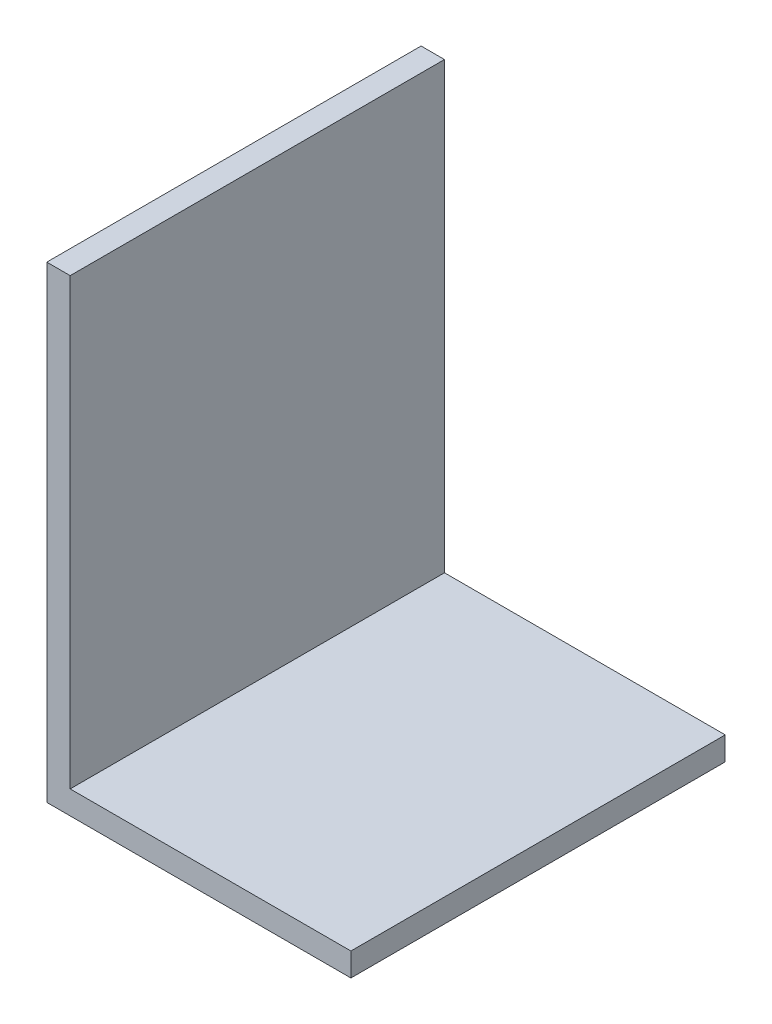
ISO-10303-21;
HEADER;
FILE_DESCRIPTION(('STEP AP214'),'2;1');
FILE_NAME('part.step','',(''),(''),'','','');
FILE_SCHEMA(('AUTOMOTIVE_DESIGN { 1 0 10303 214 1 1 1 1 }'));
ENDSEC;
DATA;
#1=APPLICATION_CONTEXT('core data for automotive mechanical design processes');
#2=APPLICATION_PROTOCOL_DEFINITION('international standard','automotive_design',2000,#1);
#3=PRODUCT_CONTEXT('',#1,'mechanical');
#4=PRODUCT('Part','Part','',(#3));
#5=PRODUCT_RELATED_PRODUCT_CATEGORY('part','',(#4));
#6=PRODUCT_DEFINITION_FORMATION('','',#4);
#7=PRODUCT_DEFINITION_CONTEXT('part definition',#1,'design');
#8=PRODUCT_DEFINITION('design','',#6,#7);
#9=PRODUCT_DEFINITION_SHAPE('','',#8);
#10=(LENGTH_UNIT() NAMED_UNIT(*) SI_UNIT(.MILLI.,.METRE.));
#11=(NAMED_UNIT(*) PLANE_ANGLE_UNIT() SI_UNIT($,.RADIAN.));
#12=(NAMED_UNIT(*) SI_UNIT($,.STERADIAN.) SOLID_ANGLE_UNIT());
#13=UNCERTAINTY_MEASURE_WITH_UNIT(LENGTH_MEASURE(1.E-05),#10,'distance_accuracy_value','');
#14=(GEOMETRIC_REPRESENTATION_CONTEXT(3) GLOBAL_UNCERTAINTY_ASSIGNED_CONTEXT((#13)) GLOBAL_UNIT_ASSIGNED_CONTEXT((#10,
#11,#12)) REPRESENTATION_CONTEXT('',''));
#15=CARTESIAN_POINT('',(0.,0.,0.));
#16=DIRECTION('',(0.,0.,1.));
#17=DIRECTION('',(1.,0.,0.));
#18=AXIS2_PLACEMENT_3D('',#15,#16,#17);
#19=CARTESIAN_POINT('',(0.,-1.,16.));
#20=DIRECTION('',(0.,1.,0.));
#21=DIRECTION('',(0.,0.,1.));
#22=AXIS2_PLACEMENT_3D('',#19,#20,#21);
#23=PLANE('',#22);
#24=DIRECTION('',(1.,0.,0.));
#25=VECTOR('',#24,1.);
#26=CARTESIAN_POINT('',(0.,-1.,0.));
#27=LINE('',#26,#25);
#28=CARTESIAN_POINT('',(-1.,-1.,0.));
#29=VERTEX_POINT('',#28);
#30=CARTESIAN_POINT('',(12.,-1.,0.));
#31=VERTEX_POINT('',#30);
#32=EDGE_CURVE('E114',#29,#31,#27,.T.);
#33=ORIENTED_EDGE('',*,*,#32,.T.);
#34=DIRECTION('',(0.,0.,-1.));
#35=VECTOR('',#34,1.);
#36=CARTESIAN_POINT('',(12.,-1.,16.));
#37=LINE('',#36,#35);
#38=CARTESIAN_POINT('',(12.,-1.,16.));
#39=VERTEX_POINT('',#38);
#40=EDGE_CURVE('E11',#39,#31,#37,.T.);
#41=ORIENTED_EDGE('',*,*,#40,.F.);
#42=DIRECTION('',(1.,0.,0.));
#43=VECTOR('',#42,1.);
#44=CARTESIAN_POINT('',(0.,-1.,16.));
#45=LINE('',#44,#43);
#46=CARTESIAN_POINT('',(-1.,-1.,16.));
#47=VERTEX_POINT('',#46);
#48=EDGE_CURVE('E79',#47,#39,#45,.T.);
#49=ORIENTED_EDGE('',*,*,#48,.F.);
#50=DIRECTION('',(0.,0.,-1.));
#51=VECTOR('',#50,1.);
#52=CARTESIAN_POINT('',(-1.,-1.,16.));
#53=LINE('',#52,#51);
#54=EDGE_CURVE('E110',#47,#29,#53,.T.);
#55=ORIENTED_EDGE('',*,*,#54,.T.);
#56=EDGE_LOOP('',(#33,#41,#49,#55));
#57=FACE_BOUND('',#56,.T.);
#58=ADVANCED_FACE('F33',(#57),#23,.F.);
#59=CARTESIAN_POINT('',(12.,0.,16.));
#60=DIRECTION('',(1.,0.,0.));
#61=DIRECTION('',(0.,0.,-1.));
#62=AXIS2_PLACEMENT_3D('',#59,#60,#61);
#63=PLANE('',#62);
#64=DIRECTION('',(0.,-1.,0.));
#65=VECTOR('',#64,1.);
#66=CARTESIAN_POINT('',(12.,0.,0.));
#67=LINE('',#66,#65);
#68=CARTESIAN_POINT('',(12.,0.,0.));
#69=VERTEX_POINT('',#68);
#70=EDGE_CURVE('E117',#69,#31,#67,.T.);
#71=ORIENTED_EDGE('',*,*,#70,.F.);
#72=DIRECTION('',(0.,0.,-1.));
#73=VECTOR('',#72,1.);
#74=CARTESIAN_POINT('',(12.,0.,16.));
#75=LINE('',#74,#73);
#76=CARTESIAN_POINT('',(12.,0.,16.));
#77=VERTEX_POINT('',#76);
#78=EDGE_CURVE('E41',#77,#69,#75,.T.);
#79=ORIENTED_EDGE('',*,*,#78,.F.);
#80=DIRECTION('',(0.,-1.,0.));
#81=VECTOR('',#80,1.);
#82=CARTESIAN_POINT('',(12.,0.,16.));
#83=LINE('',#82,#81);
#84=EDGE_CURVE('E203',#77,#39,#83,.T.);
#85=ORIENTED_EDGE('',*,*,#84,.T.);
#86=ORIENTED_EDGE('',*,*,#40,.T.);
#87=EDGE_LOOP('',(#71,#79,#85,#86));
#88=FACE_BOUND('',#87,.T.);
#89=ADVANCED_FACE('F135',(#88),#63,.T.);
#90=CARTESIAN_POINT('',(0.,0.,16.));
#91=DIRECTION('',(0.,1.,0.));
#92=DIRECTION('',(0.,0.,1.));
#93=AXIS2_PLACEMENT_3D('',#90,#91,#92);
#94=PLANE('',#93);
#95=DIRECTION('',(1.,0.,0.));
#96=VECTOR('',#95,1.);
#97=CARTESIAN_POINT('',(0.,0.,0.));
#98=LINE('',#97,#96);
#99=CARTESIAN_POINT('',(0.,0.,0.));
#100=VERTEX_POINT('',#99);
#101=EDGE_CURVE('E120',#100,#69,#98,.T.);
#102=ORIENTED_EDGE('',*,*,#101,.F.);
#103=DIRECTION('',(0.,0.,-1.));
#104=VECTOR('',#103,1.);
#105=CARTESIAN_POINT('',(0.,0.,16.));
#106=LINE('',#105,#104);
#107=CARTESIAN_POINT('',(0.,0.,16.));
#108=VERTEX_POINT('',#107);
#109=EDGE_CURVE('E100',#108,#100,#106,.T.);
#110=ORIENTED_EDGE('',*,*,#109,.F.);
#111=DIRECTION('',(1.,0.,0.));
#112=VECTOR('',#111,1.);
#113=CARTESIAN_POINT('',(0.,0.,16.));
#114=LINE('',#113,#112);
#115=EDGE_CURVE('E106',#108,#77,#114,.T.);
#116=ORIENTED_EDGE('',*,*,#115,.T.);
#117=ORIENTED_EDGE('',*,*,#78,.T.);
#118=EDGE_LOOP('',(#102,#110,#116,#117));
#119=FACE_BOUND('',#118,.T.);
#120=ADVANCED_FACE('F132',(#119),#94,.T.);
#121=CARTESIAN_POINT('',(0.,0.,16.));
#122=DIRECTION('',(1.,0.,0.));
#123=DIRECTION('',(0.,0.,-1.));
#124=AXIS2_PLACEMENT_3D('',#121,#122,#123);
#125=PLANE('',#124);
#126=DIRECTION('',(0.,-1.,0.));
#127=VECTOR('',#126,1.);
#128=CARTESIAN_POINT('',(0.,0.,0.));
#129=LINE('',#128,#127);
#130=CARTESIAN_POINT('',(0.,19.,0.));
#131=VERTEX_POINT('',#130);
#132=EDGE_CURVE('E95',#131,#100,#129,.T.);
#133=ORIENTED_EDGE('',*,*,#132,.F.);
#134=DIRECTION('',(0.,0.,-1.));
#135=VECTOR('',#134,1.);
#136=CARTESIAN_POINT('',(0.,19.,16.));
#137=LINE('',#136,#135);
#138=CARTESIAN_POINT('',(0.,19.,16.));
#139=VERTEX_POINT('',#138);
#140=EDGE_CURVE('E90',#139,#131,#137,.T.);
#141=ORIENTED_EDGE('',*,*,#140,.F.);
#142=DIRECTION('',(0.,-1.,0.));
#143=VECTOR('',#142,1.);
#144=CARTESIAN_POINT('',(0.,0.,16.));
#145=LINE('',#144,#143);
#146=EDGE_CURVE('E93',#139,#108,#145,.T.);
#147=ORIENTED_EDGE('',*,*,#146,.T.);
#148=ORIENTED_EDGE('',*,*,#109,.T.);
#149=EDGE_LOOP('',(#133,#141,#147,#148));
#150=FACE_BOUND('',#149,.T.);
#151=ADVANCED_FACE('F92',(#150),#125,.T.);
#152=CARTESIAN_POINT('',(-1.,19.,16.));
#153=DIRECTION('',(0.,1.,0.));
#154=DIRECTION('',(0.,0.,1.));
#155=AXIS2_PLACEMENT_3D('',#152,#153,#154);
#156=PLANE('',#155);
#157=DIRECTION('',(1.,0.,0.));
#158=VECTOR('',#157,1.);
#159=CARTESIAN_POINT('',(-1.,19.,0.));
#160=LINE('',#159,#158);
#161=CARTESIAN_POINT('',(-1.,19.,0.));
#162=VERTEX_POINT('',#161);
#163=EDGE_CURVE('E124',#162,#131,#160,.T.);
#164=ORIENTED_EDGE('',*,*,#163,.F.);
#165=DIRECTION('',(0.,0.,-1.));
#166=VECTOR('',#165,1.);
#167=CARTESIAN_POINT('',(-1.,19.,16.));
#168=LINE('',#167,#166);
#169=CARTESIAN_POINT('',(-1.,19.,16.));
#170=VERTEX_POINT('',#169);
#171=EDGE_CURVE('E70',#170,#162,#168,.T.);
#172=ORIENTED_EDGE('',*,*,#171,.F.);
#173=DIRECTION('',(1.,0.,0.));
#174=VECTOR('',#173,1.);
#175=CARTESIAN_POINT('',(-1.,19.,16.));
#176=LINE('',#175,#174);
#177=EDGE_CURVE('E104',#170,#139,#176,.T.);
#178=ORIENTED_EDGE('',*,*,#177,.T.);
#179=ORIENTED_EDGE('',*,*,#140,.T.);
#180=EDGE_LOOP('',(#164,#172,#178,#179));
#181=FACE_BOUND('',#180,.T.);
#182=ADVANCED_FACE('F108',(#181),#156,.T.);
#183=CARTESIAN_POINT('',(-1.,0.,16.));
#184=DIRECTION('',(1.,0.,0.));
#185=DIRECTION('',(0.,0.,-1.));
#186=AXIS2_PLACEMENT_3D('',#183,#184,#185);
#187=PLANE('',#186);
#188=DIRECTION('',(0.,1.,0.));
#189=VECTOR('',#188,1.);
#190=CARTESIAN_POINT('',(-1.,0.,0.));
#191=LINE('',#190,#189);
#192=EDGE_CURVE('E73',#162,#29,#191,.F.);
#193=ORIENTED_EDGE('',*,*,#192,.T.);
#194=ORIENTED_EDGE('',*,*,#54,.F.);
#195=DIRECTION('',(0.,1.,0.));
#196=VECTOR('',#195,1.);
#197=CARTESIAN_POINT('',(-1.,0.,16.));
#198=LINE('',#197,#196);
#199=EDGE_CURVE('E49',#170,#47,#198,.F.);
#200=ORIENTED_EDGE('',*,*,#199,.F.);
#201=ORIENTED_EDGE('',*,*,#171,.T.);
#202=EDGE_LOOP('',(#193,#194,#200,#201));
#203=FACE_BOUND('',#202,.T.);
#204=ADVANCED_FACE('F140',(#203),#187,.F.);
#205=CARTESIAN_POINT('',(0.,0.,16.));
#206=DIRECTION('',(0.,0.,-1.));
#207=DIRECTION('',(-1.,0.,0.));
#208=AXIS2_PLACEMENT_3D('',#205,#206,#207);
#209=PLANE('',#208);
#210=ORIENTED_EDGE('',*,*,#48,.T.);
#211=ORIENTED_EDGE('',*,*,#84,.F.);
#212=ORIENTED_EDGE('',*,*,#115,.F.);
#213=ORIENTED_EDGE('',*,*,#146,.F.);
#214=ORIENTED_EDGE('',*,*,#177,.F.);
#215=ORIENTED_EDGE('',*,*,#199,.T.);
#216=EDGE_LOOP('',(#210,#211,#212,#213,#214,#215));
#217=FACE_BOUND('',#216,.T.);
#218=ADVANCED_FACE('F103',(#217),#209,.F.);
#219=CARTESIAN_POINT('',(0.,0.,0.));
#220=DIRECTION('',(0.,0.,-1.));
#221=DIRECTION('',(-1.,0.,0.));
#222=AXIS2_PLACEMENT_3D('',#219,#220,#221);
#223=PLANE('',#222);
#224=ORIENTED_EDGE('',*,*,#32,.F.);
#225=ORIENTED_EDGE('',*,*,#192,.F.);
#226=ORIENTED_EDGE('',*,*,#163,.T.);
#227=ORIENTED_EDGE('',*,*,#132,.T.);
#228=ORIENTED_EDGE('',*,*,#101,.T.);
#229=ORIENTED_EDGE('',*,*,#70,.T.);
#230=EDGE_LOOP('',(#224,#225,#226,#227,#228,#229));
#231=FACE_BOUND('',#230,.T.);
#232=ADVANCED_FACE('F138',(#231),#223,.T.);
#233=CLOSED_SHELL('',(#58,#89,#120,#151,#182,#204,#218,#232));
#234=MANIFOLD_SOLID_BREP('B2',#233);
#235=ADVANCED_BREP_SHAPE_REPRESENTATION('',(#18,#234),#14);
#236=SHAPE_DEFINITION_REPRESENTATION(#9,#235);
ENDSEC;
END-ISO-10303-21;
